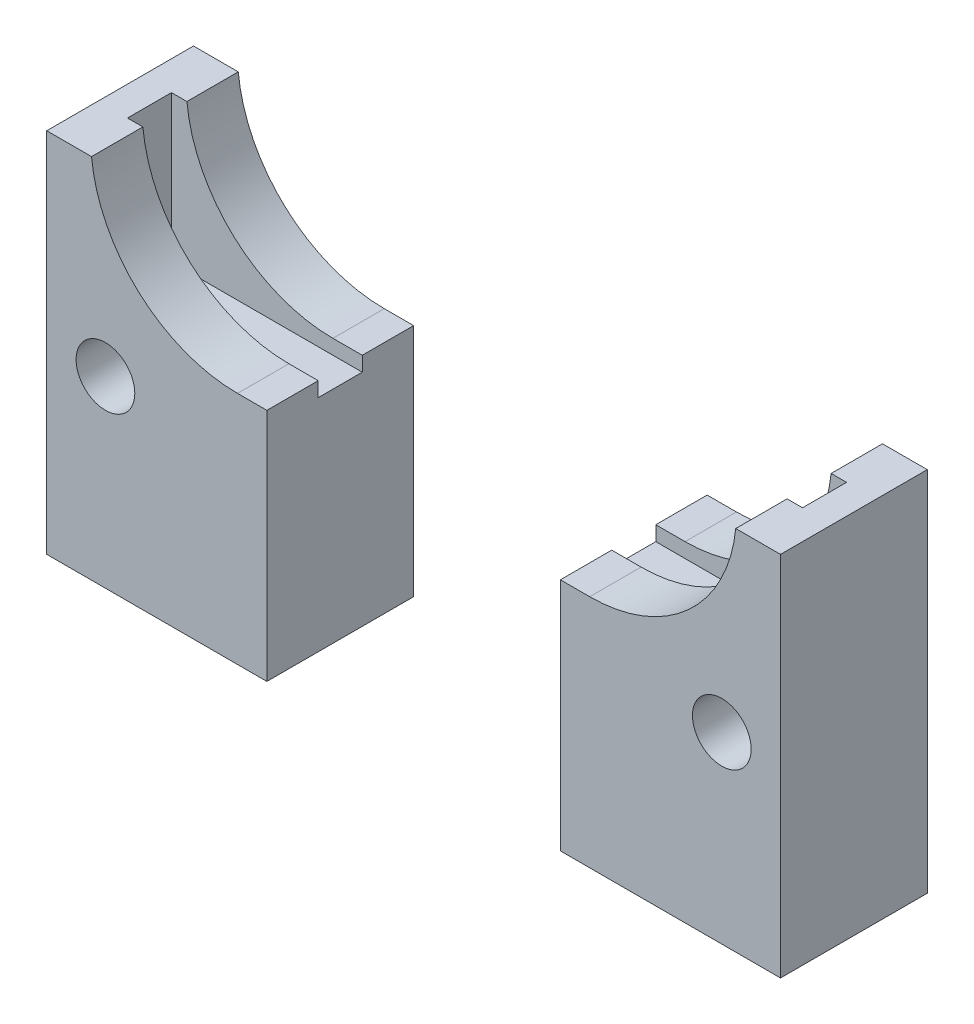
ISO-10303-21;
HEADER;
FILE_DESCRIPTION(('STEP AP214'),'2;1');
FILE_NAME('part.step','',(''),(''),'','','');
FILE_SCHEMA(('AUTOMOTIVE_DESIGN { 1 0 10303 214 1 1 1 1 }'));
ENDSEC;
DATA;
#1=APPLICATION_CONTEXT('core data for automotive mechanical design processes');
#2=APPLICATION_PROTOCOL_DEFINITION('international standard','automotive_design',2000,#1);
#3=PRODUCT_CONTEXT('',#1,'mechanical');
#4=PRODUCT('Part','Part','',(#3));
#5=PRODUCT_RELATED_PRODUCT_CATEGORY('part','',(#4));
#6=PRODUCT_DEFINITION_FORMATION('','',#4);
#7=PRODUCT_DEFINITION_CONTEXT('part definition',#1,'design');
#8=PRODUCT_DEFINITION('design','',#6,#7);
#9=PRODUCT_DEFINITION_SHAPE('','',#8);
#10=(LENGTH_UNIT() NAMED_UNIT(*) SI_UNIT(.MILLI.,.METRE.));
#11=(NAMED_UNIT(*) PLANE_ANGLE_UNIT() SI_UNIT($,.RADIAN.));
#12=(NAMED_UNIT(*) SI_UNIT($,.STERADIAN.) SOLID_ANGLE_UNIT());
#13=UNCERTAINTY_MEASURE_WITH_UNIT(LENGTH_MEASURE(1.E-05),#10,'distance_accuracy_value','');
#14=(GEOMETRIC_REPRESENTATION_CONTEXT(3) GLOBAL_UNCERTAINTY_ASSIGNED_CONTEXT((#13)) GLOBAL_UNIT_ASSIGNED_CONTEXT((#10,
#11,#12)) REPRESENTATION_CONTEXT('',''));
#15=CARTESIAN_POINT('',(0.,0.,0.));
#16=DIRECTION('',(0.,0.,1.));
#17=DIRECTION('',(1.,0.,0.));
#18=AXIS2_PLACEMENT_3D('',#15,#16,#17);
#19=CARTESIAN_POINT('',(25.,15.,5.));
#20=DIRECTION('',(-1.,0.,0.));
#21=DIRECTION('',(0.,0.,1.));
#22=AXIS2_PLACEMENT_3D('',#19,#20,#21);
#23=PLANE('',#22);
#24=DIRECTION('',(0.,-1.,0.));
#25=VECTOR('',#24,1.);
#26=CARTESIAN_POINT('',(25.,15.,5.));
#27=LINE('',#26,#25);
#28=CARTESIAN_POINT('',(25.,15.,5.));
#29=VERTEX_POINT('',#28);
#30=CARTESIAN_POINT('',(25.,-10.,5.));
#31=VERTEX_POINT('',#30);
#32=EDGE_CURVE('E153',#29,#31,#27,.T.);
#33=ORIENTED_EDGE('',*,*,#32,.T.);
#34=DIRECTION('',(0.,0.,1.));
#35=VECTOR('',#34,1.);
#36=CARTESIAN_POINT('',(25.,-10.,-5.));
#37=LINE('',#36,#35);
#38=CARTESIAN_POINT('',(25.,-10.,-5.));
#39=VERTEX_POINT('',#38);
#40=EDGE_CURVE('E236',#39,#31,#37,.T.);
#41=ORIENTED_EDGE('',*,*,#40,.F.);
#42=DIRECTION('',(0.,-1.,0.));
#43=VECTOR('',#42,1.);
#44=CARTESIAN_POINT('',(25.,15.,-5.));
#45=LINE('',#44,#43);
#46=CARTESIAN_POINT('',(25.,15.,-5.));
#47=VERTEX_POINT('',#46);
#48=EDGE_CURVE('E148',#47,#39,#45,.T.);
#49=ORIENTED_EDGE('',*,*,#48,.F.);
#50=DIRECTION('',(0.,0.,-1.));
#51=VECTOR('',#50,1.);
#52=CARTESIAN_POINT('',(25.,15.,5.));
#53=LINE('',#52,#51);
#54=EDGE_CURVE('E163',#29,#47,#53,.T.);
#55=ORIENTED_EDGE('',*,*,#54,.F.);
#56=EDGE_LOOP('',(#33,#41,#49,#55));
#57=FACE_BOUND('',#56,.T.);
#58=ADVANCED_FACE('F47',(#57),#23,.F.);
#59=CARTESIAN_POINT('',(-25.,15.,-5.));
#60=DIRECTION('',(0.,0.,1.));
#61=DIRECTION('',(1.,0.,0.));
#62=AXIS2_PLACEMENT_3D('',#59,#60,#61);
#63=PLANE('',#62);
#64=CARTESIAN_POINT('',(21.,2.5,-5.));
#65=DIRECTION('',(0.,0.,1.));
#66=DIRECTION('',(1.,0.,0.));
#67=AXIS2_PLACEMENT_3D('',#64,#65,#66);
#68=CIRCLE('',#67,2.);
#69=CARTESIAN_POINT('',(23.,2.5,-5.));
#70=VERTEX_POINT('',#69);
#71=EDGE_CURVE('E243',#70,#70,#68,.T.);
#72=ORIENTED_EDGE('',*,*,#71,.T.);
#73=EDGE_LOOP('',(#72));
#74=FACE_BOUND('',#73,.T.);
#75=DIRECTION('',(1.,0.,0.));
#76=VECTOR('',#75,1.);
#77=CARTESIAN_POINT('',(0.,6.,-5.));
#78=LINE('',#77,#76);
#79=CARTESIAN_POINT('',(10.,6.,-5.));
#80=VERTEX_POINT('',#79);
#81=CARTESIAN_POINT('',(12.,6.,-5.));
#82=VERTEX_POINT('',#81);
#83=EDGE_CURVE('E131',#80,#82,#78,.T.);
#84=ORIENTED_EDGE('',*,*,#83,.T.);
#85=CARTESIAN_POINT('',(12.,16.,-5.));
#86=DIRECTION('',(0.,0.,1.));
#87=DIRECTION('',(1.,0.,0.));
#88=AXIS2_PLACEMENT_3D('',#85,#86,#87);
#89=CIRCLE('',#88,10.);
#90=CARTESIAN_POINT('',(21.9498743710662,15.,-5.));
#91=VERTEX_POINT('',#90);
#92=EDGE_CURVE('E142',#82,#91,#89,.T.);
#93=ORIENTED_EDGE('',*,*,#92,.T.);
#94=DIRECTION('',(-1.,0.,0.));
#95=VECTOR('',#94,1.);
#96=CARTESIAN_POINT('',(-25.,15.,-5.));
#97=LINE('',#96,#95);
#98=EDGE_CURVE('E160',#47,#91,#97,.T.);
#99=ORIENTED_EDGE('',*,*,#98,.F.);
#100=ORIENTED_EDGE('',*,*,#48,.T.);
#101=DIRECTION('',(1.,0.,0.));
#102=VECTOR('',#101,1.);
#103=CARTESIAN_POINT('',(10.,-10.,-5.));
#104=LINE('',#103,#102);
#105=CARTESIAN_POINT('',(10.,-10.,-5.));
#106=VERTEX_POINT('',#105);
#107=EDGE_CURVE('E239',#106,#39,#104,.T.);
#108=ORIENTED_EDGE('',*,*,#107,.F.);
#109=DIRECTION('',(0.,1.,0.));
#110=VECTOR('',#109,1.);
#111=CARTESIAN_POINT('',(10.,0.,-5.));
#112=LINE('',#111,#110);
#113=EDGE_CURVE('E152',#106,#80,#112,.T.);
#114=ORIENTED_EDGE('',*,*,#113,.T.);
#115=EDGE_LOOP('',(#84,#93,#99,#100,#108,#114));
#116=FACE_BOUND('',#115,.T.);
#117=ADVANCED_FACE('F49',(#74,#116),#63,.F.);
#118=CARTESIAN_POINT('',(-25.,15.,5.));
#119=DIRECTION('',(0.,0.,-1.));
#120=DIRECTION('',(-1.,0.,0.));
#121=AXIS2_PLACEMENT_3D('',#118,#119,#120);
#122=PLANE('',#121);
#123=CARTESIAN_POINT('',(21.,2.5,5.));
#124=DIRECTION('',(0.,0.,1.));
#125=DIRECTION('',(1.,0.,0.));
#126=AXIS2_PLACEMENT_3D('',#123,#124,#125);
#127=CIRCLE('',#126,2.);
#128=CARTESIAN_POINT('',(23.,2.5,5.));
#129=VERTEX_POINT('',#128);
#130=EDGE_CURVE('E244',#129,#129,#127,.T.);
#131=ORIENTED_EDGE('',*,*,#130,.F.);
#132=EDGE_LOOP('',(#131));
#133=FACE_BOUND('',#132,.T.);
#134=DIRECTION('',(1.,0.,0.));
#135=VECTOR('',#134,1.);
#136=CARTESIAN_POINT('',(-25.,15.,5.));
#137=LINE('',#136,#135);
#138=CARTESIAN_POINT('',(21.9498743710662,15.,5.));
#139=VERTEX_POINT('',#138);
#140=EDGE_CURVE('E161',#139,#29,#137,.T.);
#141=ORIENTED_EDGE('',*,*,#140,.F.);
#142=CARTESIAN_POINT('',(12.,16.,5.));
#143=DIRECTION('',(0.,0.,1.));
#144=DIRECTION('',(1.,0.,0.));
#145=AXIS2_PLACEMENT_3D('',#142,#143,#144);
#146=CIRCLE('',#145,10.);
#147=CARTESIAN_POINT('',(12.,6.,5.));
#148=VERTEX_POINT('',#147);
#149=EDGE_CURVE('E138',#148,#139,#146,.T.);
#150=ORIENTED_EDGE('',*,*,#149,.F.);
#151=DIRECTION('',(1.,0.,0.));
#152=VECTOR('',#151,1.);
#153=CARTESIAN_POINT('',(0.,6.,5.));
#154=LINE('',#153,#152);
#155=CARTESIAN_POINT('',(10.,6.,5.));
#156=VERTEX_POINT('',#155);
#157=EDGE_CURVE('E192',#156,#148,#154,.T.);
#158=ORIENTED_EDGE('',*,*,#157,.F.);
#159=DIRECTION('',(0.,1.,0.));
#160=VECTOR('',#159,1.);
#161=CARTESIAN_POINT('',(10.,0.,5.));
#162=LINE('',#161,#160);
#163=CARTESIAN_POINT('',(10.,-10.,5.));
#164=VERTEX_POINT('',#163);
#165=EDGE_CURVE('E12',#164,#156,#162,.T.);
#166=ORIENTED_EDGE('',*,*,#165,.F.);
#167=DIRECTION('',(-1.,0.,0.));
#168=VECTOR('',#167,1.);
#169=CARTESIAN_POINT('',(10.,-10.,5.));
#170=LINE('',#169,#168);
#171=EDGE_CURVE('E156',#31,#164,#170,.T.);
#172=ORIENTED_EDGE('',*,*,#171,.F.);
#173=ORIENTED_EDGE('',*,*,#32,.F.);
#174=EDGE_LOOP('',(#141,#150,#158,#166,#172,#173));
#175=FACE_BOUND('',#174,.T.);
#176=ADVANCED_FACE('F211',(#133,#175),#122,.F.);
#177=CARTESIAN_POINT('',(0.,15.,0.));
#178=DIRECTION('',(0.,-1.,0.));
#179=DIRECTION('',(0.,0.,-1.));
#180=AXIS2_PLACEMENT_3D('',#177,#178,#179);
#181=PLANE('',#180);
#182=ORIENTED_EDGE('',*,*,#98,.T.);
#183=DIRECTION('',(0.,0.,1.));
#184=VECTOR('',#183,1.);
#185=CARTESIAN_POINT('',(21.9498743710662,15.,-5.));
#186=LINE('',#185,#184);
#187=CARTESIAN_POINT('',(21.9498743710662,15.,-1.5));
#188=VERTEX_POINT('',#187);
#189=EDGE_CURVE('E145',#91,#188,#186,.T.);
#190=ORIENTED_EDGE('',*,*,#189,.T.);
#191=DIRECTION('',(-1.,0.,0.));
#192=VECTOR('',#191,1.);
#193=CARTESIAN_POINT('',(-23.,15.,-1.5));
#194=LINE('',#193,#192);
#195=CARTESIAN_POINT('',(23.,15.,-1.5));
#196=VERTEX_POINT('',#195);
#197=EDGE_CURVE('E51',#196,#188,#194,.T.);
#198=ORIENTED_EDGE('',*,*,#197,.F.);
#199=DIRECTION('',(0.,0.,-1.));
#200=VECTOR('',#199,1.);
#201=CARTESIAN_POINT('',(23.,15.,-1.5));
#202=LINE('',#201,#200);
#203=CARTESIAN_POINT('',(23.,15.,1.5));
#204=VERTEX_POINT('',#203);
#205=EDGE_CURVE('E221',#204,#196,#202,.T.);
#206=ORIENTED_EDGE('',*,*,#205,.F.);
#207=DIRECTION('',(1.,0.,0.));
#208=VECTOR('',#207,1.);
#209=CARTESIAN_POINT('',(-23.,15.,1.5));
#210=LINE('',#209,#208);
#211=CARTESIAN_POINT('',(21.9498743710662,15.,1.5));
#212=VERTEX_POINT('',#211);
#213=EDGE_CURVE('E172',#212,#204,#210,.T.);
#214=ORIENTED_EDGE('',*,*,#213,.F.);
#215=EDGE_CURVE('E164',#212,#139,#186,.T.);
#216=ORIENTED_EDGE('',*,*,#215,.T.);
#217=ORIENTED_EDGE('',*,*,#140,.T.);
#218=ORIENTED_EDGE('',*,*,#54,.T.);
#219=EDGE_LOOP('',(#182,#190,#198,#206,#214,#216,#217,#218));
#220=FACE_BOUND('',#219,.T.);
#221=ADVANCED_FACE('F217',(#220),#181,.F.);
#222=CARTESIAN_POINT('',(23.,5.,-1.5));
#223=DIRECTION('',(1.,0.,0.));
#224=DIRECTION('',(0.,0.,-1.));
#225=AXIS2_PLACEMENT_3D('',#222,#223,#224);
#226=PLANE('',#225);
#227=ORIENTED_EDGE('',*,*,#205,.T.);
#228=DIRECTION('',(0.,1.,0.));
#229=VECTOR('',#228,1.);
#230=CARTESIAN_POINT('',(23.,5.,-1.5));
#231=LINE('',#230,#229);
#232=CARTESIAN_POINT('',(23.,5.,-1.5));
#233=VERTEX_POINT('',#232);
#234=EDGE_CURVE('E169',#233,#196,#231,.T.);
#235=ORIENTED_EDGE('',*,*,#234,.F.);
#236=DIRECTION('',(0.,0.,-1.));
#237=VECTOR('',#236,1.);
#238=CARTESIAN_POINT('',(23.,5.,-1.5));
#239=LINE('',#238,#237);
#240=CARTESIAN_POINT('',(23.,5.,1.5));
#241=VERTEX_POINT('',#240);
#242=EDGE_CURVE('E168',#241,#233,#239,.T.);
#243=ORIENTED_EDGE('',*,*,#242,.F.);
#244=DIRECTION('',(0.,1.,0.));
#245=VECTOR('',#244,1.);
#246=CARTESIAN_POINT('',(23.,5.,1.5));
#247=LINE('',#246,#245);
#248=EDGE_CURVE('E183',#241,#204,#247,.T.);
#249=ORIENTED_EDGE('',*,*,#248,.T.);
#250=EDGE_LOOP('',(#227,#235,#243,#249));
#251=FACE_BOUND('',#250,.T.);
#252=ADVANCED_FACE('F263',(#251),#226,.F.);
#253=CARTESIAN_POINT('',(-23.,5.,1.5));
#254=DIRECTION('',(0.,0.,1.));
#255=DIRECTION('',(1.,0.,0.));
#256=AXIS2_PLACEMENT_3D('',#253,#254,#255);
#257=PLANE('',#256);
#258=DIRECTION('',(1.,0.,0.));
#259=VECTOR('',#258,1.);
#260=CARTESIAN_POINT('',(-23.,6.,1.5));
#261=LINE('',#260,#259);
#262=CARTESIAN_POINT('',(10.,6.,1.5));
#263=VERTEX_POINT('',#262);
#264=CARTESIAN_POINT('',(12.,6.,1.5));
#265=VERTEX_POINT('',#264);
#266=EDGE_CURVE('E180',#263,#265,#261,.T.);
#267=ORIENTED_EDGE('',*,*,#266,.T.);
#268=CARTESIAN_POINT('',(12.,16.,1.5));
#269=DIRECTION('',(0.,0.,1.));
#270=DIRECTION('',(1.,0.,0.));
#271=AXIS2_PLACEMENT_3D('',#268,#269,#270);
#272=CIRCLE('',#271,10.);
#273=EDGE_CURVE('E173',#265,#212,#272,.T.);
#274=ORIENTED_EDGE('',*,*,#273,.T.);
#275=ORIENTED_EDGE('',*,*,#213,.T.);
#276=ORIENTED_EDGE('',*,*,#248,.F.);
#277=DIRECTION('',(1.,0.,0.));
#278=VECTOR('',#277,1.);
#279=CARTESIAN_POINT('',(-23.,5.,1.5));
#280=LINE('',#279,#278);
#281=CARTESIAN_POINT('',(10.,5.,1.5));
#282=VERTEX_POINT('',#281);
#283=EDGE_CURVE('E166',#282,#241,#280,.T.);
#284=ORIENTED_EDGE('',*,*,#283,.F.);
#285=DIRECTION('',(0.,1.,0.));
#286=VECTOR('',#285,1.);
#287=CARTESIAN_POINT('',(10.,5.,1.5));
#288=LINE('',#287,#286);
#289=EDGE_CURVE('E65',#282,#263,#288,.T.);
#290=ORIENTED_EDGE('',*,*,#289,.T.);
#291=EDGE_LOOP('',(#267,#274,#275,#276,#284,#290));
#292=FACE_BOUND('',#291,.T.);
#293=ADVANCED_FACE('F274',(#292),#257,.F.);
#294=CARTESIAN_POINT('',(-23.,5.,-1.5));
#295=DIRECTION('',(0.,0.,-1.));
#296=DIRECTION('',(-1.,0.,0.));
#297=AXIS2_PLACEMENT_3D('',#294,#295,#296);
#298=PLANE('',#297);
#299=ORIENTED_EDGE('',*,*,#197,.T.);
#300=CARTESIAN_POINT('',(12.,16.,-1.5));
#301=DIRECTION('',(0.,0.,-1.));
#302=DIRECTION('',(-1.,0.,0.));
#303=AXIS2_PLACEMENT_3D('',#300,#301,#302);
#304=CIRCLE('',#303,10.);
#305=CARTESIAN_POINT('',(12.,6.,-1.5));
#306=VERTEX_POINT('',#305);
#307=EDGE_CURVE('E233',#188,#306,#304,.T.);
#308=ORIENTED_EDGE('',*,*,#307,.T.);
#309=DIRECTION('',(-1.,0.,0.));
#310=VECTOR('',#309,1.);
#311=CARTESIAN_POINT('',(-23.,6.,-1.5));
#312=LINE('',#311,#310);
#313=CARTESIAN_POINT('',(10.,6.,-1.5));
#314=VERTEX_POINT('',#313);
#315=EDGE_CURVE('E134',#306,#314,#312,.T.);
#316=ORIENTED_EDGE('',*,*,#315,.T.);
#317=DIRECTION('',(0.,-1.,0.));
#318=VECTOR('',#317,1.);
#319=CARTESIAN_POINT('',(10.,5.,-1.5));
#320=LINE('',#319,#318);
#321=CARTESIAN_POINT('',(10.,5.,-1.5));
#322=VERTEX_POINT('',#321);
#323=EDGE_CURVE('E188',#314,#322,#320,.T.);
#324=ORIENTED_EDGE('',*,*,#323,.T.);
#325=DIRECTION('',(-1.,0.,0.));
#326=VECTOR('',#325,1.);
#327=CARTESIAN_POINT('',(-23.,5.,-1.5));
#328=LINE('',#327,#326);
#329=EDGE_CURVE('E170',#233,#322,#328,.T.);
#330=ORIENTED_EDGE('',*,*,#329,.F.);
#331=ORIENTED_EDGE('',*,*,#234,.T.);
#332=EDGE_LOOP('',(#299,#308,#316,#324,#330,#331));
#333=FACE_BOUND('',#332,.T.);
#334=ADVANCED_FACE('F284',(#333),#298,.F.);
#335=CARTESIAN_POINT('',(0.,5.,0.));
#336=DIRECTION('',(0.,1.,0.));
#337=DIRECTION('',(0.,0.,1.));
#338=AXIS2_PLACEMENT_3D('',#335,#336,#337);
#339=PLANE('',#338);
#340=DIRECTION('',(0.,0.,-1.));
#341=VECTOR('',#340,1.);
#342=CARTESIAN_POINT('',(10.,5.,0.));
#343=LINE('',#342,#341);
#344=EDGE_CURVE('E57',#282,#322,#343,.T.);
#345=ORIENTED_EDGE('',*,*,#344,.F.);
#346=ORIENTED_EDGE('',*,*,#283,.T.);
#347=ORIENTED_EDGE('',*,*,#242,.T.);
#348=ORIENTED_EDGE('',*,*,#329,.T.);
#349=EDGE_LOOP('',(#345,#346,#347,#348));
#350=FACE_BOUND('',#349,.T.);
#351=ADVANCED_FACE('F281',(#350),#339,.T.);
#352=CARTESIAN_POINT('',(12.,16.,-5.));
#353=DIRECTION('',(0.,0.,1.));
#354=DIRECTION('',(1.,0.,0.));
#355=AXIS2_PLACEMENT_3D('',#352,#353,#354);
#356=CYLINDRICAL_SURFACE('',#355,10.);
#357=DIRECTION('',(0.,0.,1.));
#358=VECTOR('',#357,1.);
#359=CARTESIAN_POINT('',(12.,6.,-5.));
#360=LINE('',#359,#358);
#361=EDGE_CURVE('E140',#265,#148,#360,.T.);
#362=ORIENTED_EDGE('',*,*,#361,.T.);
#363=ORIENTED_EDGE('',*,*,#149,.T.);
#364=ORIENTED_EDGE('',*,*,#215,.F.);
#365=ORIENTED_EDGE('',*,*,#273,.F.);
#366=EDGE_LOOP('',(#362,#363,#364,#365));
#367=FACE_BOUND('',#366,.T.);
#368=ADVANCED_FACE('F215',(#367),#356,.F.);
#369=ORIENTED_EDGE('',*,*,#189,.F.);
#370=ORIENTED_EDGE('',*,*,#92,.F.);
#371=EDGE_CURVE('E126',#82,#306,#360,.T.);
#372=ORIENTED_EDGE('',*,*,#371,.T.);
#373=ORIENTED_EDGE('',*,*,#307,.F.);
#374=EDGE_LOOP('',(#369,#370,#372,#373));
#375=FACE_BOUND('',#374,.T.);
#376=ADVANCED_FACE('F143',(#375),#356,.F.);
#377=CARTESIAN_POINT('',(0.,6.,-5.));
#378=DIRECTION('',(0.,-1.,0.));
#379=DIRECTION('',(0.,0.,-1.));
#380=AXIS2_PLACEMENT_3D('',#377,#378,#379);
#381=PLANE('',#380);
#382=DIRECTION('',(0.,0.,1.));
#383=VECTOR('',#382,1.);
#384=CARTESIAN_POINT('',(10.,6.,-5.));
#385=LINE('',#384,#383);
#386=EDGE_CURVE('E137',#263,#156,#385,.T.);
#387=ORIENTED_EDGE('',*,*,#386,.T.);
#388=ORIENTED_EDGE('',*,*,#157,.T.);
#389=ORIENTED_EDGE('',*,*,#361,.F.);
#390=ORIENTED_EDGE('',*,*,#266,.F.);
#391=EDGE_LOOP('',(#387,#388,#389,#390));
#392=FACE_BOUND('',#391,.T.);
#393=ADVANCED_FACE('F201',(#392),#381,.F.);
#394=ORIENTED_EDGE('',*,*,#371,.F.);
#395=ORIENTED_EDGE('',*,*,#83,.F.);
#396=EDGE_CURVE('E191',#80,#314,#385,.T.);
#397=ORIENTED_EDGE('',*,*,#396,.T.);
#398=ORIENTED_EDGE('',*,*,#315,.F.);
#399=EDGE_LOOP('',(#394,#395,#397,#398));
#400=FACE_BOUND('',#399,.T.);
#401=ADVANCED_FACE('F128',(#400),#381,.F.);
#402=CARTESIAN_POINT('',(10.,0.,-5.));
#403=DIRECTION('',(1.,0.,0.));
#404=DIRECTION('',(0.,0.,-1.));
#405=AXIS2_PLACEMENT_3D('',#402,#403,#404);
#406=PLANE('',#405);
#407=ORIENTED_EDGE('',*,*,#344,.T.);
#408=ORIENTED_EDGE('',*,*,#323,.F.);
#409=ORIENTED_EDGE('',*,*,#396,.F.);
#410=ORIENTED_EDGE('',*,*,#113,.F.);
#411=DIRECTION('',(0.,0.,-1.));
#412=VECTOR('',#411,1.);
#413=CARTESIAN_POINT('',(10.,-10.,-5.));
#414=LINE('',#413,#412);
#415=EDGE_CURVE('E206',#164,#106,#414,.T.);
#416=ORIENTED_EDGE('',*,*,#415,.F.);
#417=ORIENTED_EDGE('',*,*,#165,.T.);
#418=ORIENTED_EDGE('',*,*,#386,.F.);
#419=ORIENTED_EDGE('',*,*,#289,.F.);
#420=EDGE_LOOP('',(#407,#408,#409,#410,#416,#417,#418,#419));
#421=FACE_BOUND('',#420,.T.);
#422=ADVANCED_FACE('F204',(#421),#406,.F.);
#423=CARTESIAN_POINT('',(0.,-10.,0.));
#424=DIRECTION('',(0.,1.,0.));
#425=DIRECTION('',(0.,0.,1.));
#426=AXIS2_PLACEMENT_3D('',#423,#424,#425);
#427=PLANE('',#426);
#428=ORIENTED_EDGE('',*,*,#415,.T.);
#429=ORIENTED_EDGE('',*,*,#107,.T.);
#430=ORIENTED_EDGE('',*,*,#40,.T.);
#431=ORIENTED_EDGE('',*,*,#171,.T.);
#432=EDGE_LOOP('',(#428,#429,#430,#431));
#433=FACE_BOUND('',#432,.T.);
#434=ADVANCED_FACE('F254',(#433),#427,.F.);
#435=CARTESIAN_POINT('',(21.,2.5,-5.));
#436=DIRECTION('',(0.,0.,1.));
#437=DIRECTION('',(1.,0.,0.));
#438=AXIS2_PLACEMENT_3D('',#435,#436,#437);
#439=CYLINDRICAL_SURFACE('',#438,2.);
#440=ORIENTED_EDGE('',*,*,#71,.F.);
#441=EDGE_LOOP('',(#440));
#442=FACE_BOUND('',#441,.T.);
#443=ORIENTED_EDGE('',*,*,#130,.T.);
#444=EDGE_LOOP('',(#443));
#445=FACE_BOUND('',#444,.T.);
#446=ADVANCED_FACE('F251',(#442,#445),#439,.F.);
#447=CLOSED_SHELL('',(#58,#117,#176,#221,#252,#293,#334,#351,#368,#376,#393,#401,#422,#434,#446));
#448=MANIFOLD_SOLID_BREP('B2',#447);
#449=CARTESIAN_POINT('',(-25.,15.,5.));
#450=DIRECTION('',(1.,0.,0.));
#451=DIRECTION('',(0.,0.,-1.));
#452=AXIS2_PLACEMENT_3D('',#449,#450,#451);
#453=PLANE('',#452);
#454=DIRECTION('',(0.,-1.,0.));
#455=VECTOR('',#454,1.);
#456=CARTESIAN_POINT('',(-25.,15.,-5.));
#457=LINE('',#456,#455);
#458=CARTESIAN_POINT('',(-25.,15.,-5.));
#459=VERTEX_POINT('',#458);
#460=CARTESIAN_POINT('',(-25.,-10.,-5.));
#461=VERTEX_POINT('',#460);
#462=EDGE_CURVE('E506',#459,#461,#457,.T.);
#463=ORIENTED_EDGE('',*,*,#462,.T.);
#464=DIRECTION('',(0.,0.,-1.));
#465=VECTOR('',#464,1.);
#466=CARTESIAN_POINT('',(-25.,-10.,-5.));
#467=LINE('',#466,#465);
#468=CARTESIAN_POINT('',(-25.,-10.,5.));
#469=VERTEX_POINT('',#468);
#470=EDGE_CURVE('E509',#469,#461,#467,.T.);
#471=ORIENTED_EDGE('',*,*,#470,.F.);
#472=DIRECTION('',(0.,-1.,0.));
#473=VECTOR('',#472,1.);
#474=CARTESIAN_POINT('',(-25.,15.,5.));
#475=LINE('',#474,#473);
#476=CARTESIAN_POINT('',(-25.,15.,5.));
#477=VERTEX_POINT('',#476);
#478=EDGE_CURVE('E513',#477,#469,#475,.T.);
#479=ORIENTED_EDGE('',*,*,#478,.F.);
#480=DIRECTION('',(0.,0.,1.));
#481=VECTOR('',#480,1.);
#482=CARTESIAN_POINT('',(-25.,15.,5.));
#483=LINE('',#482,#481);
#484=EDGE_CURVE('E439',#459,#477,#483,.T.);
#485=ORIENTED_EDGE('',*,*,#484,.F.);
#486=EDGE_LOOP('',(#463,#471,#479,#485));
#487=FACE_BOUND('',#486,.T.);
#488=ADVANCED_FACE('F416',(#487),#453,.F.);
#489=CARTESIAN_POINT('',(-23.,5.,-1.5));
#490=DIRECTION('',(-1.,0.,0.));
#491=DIRECTION('',(0.,0.,1.));
#492=AXIS2_PLACEMENT_3D('',#489,#490,#491);
#493=PLANE('',#492);
#494=DIRECTION('',(0.,0.,1.));
#495=VECTOR('',#494,1.);
#496=CARTESIAN_POINT('',(-23.,15.,-1.5));
#497=LINE('',#496,#495);
#498=CARTESIAN_POINT('',(-23.,15.,-1.5));
#499=VERTEX_POINT('',#498);
#500=CARTESIAN_POINT('',(-23.,15.,1.5));
#501=VERTEX_POINT('',#500);
#502=EDGE_CURVE('E581',#499,#501,#497,.T.);
#503=ORIENTED_EDGE('',*,*,#502,.T.);
#504=DIRECTION('',(0.,1.,0.));
#505=VECTOR('',#504,1.);
#506=CARTESIAN_POINT('',(-23.,5.,1.5));
#507=LINE('',#506,#505);
#508=CARTESIAN_POINT('',(-23.,5.,1.5));
#509=VERTEX_POINT('',#508);
#510=EDGE_CURVE('E586',#509,#501,#507,.T.);
#511=ORIENTED_EDGE('',*,*,#510,.F.);
#512=DIRECTION('',(0.,0.,1.));
#513=VECTOR('',#512,1.);
#514=CARTESIAN_POINT('',(-23.,5.,-1.5));
#515=LINE('',#514,#513);
#516=CARTESIAN_POINT('',(-23.,5.,-1.5));
#517=VERTEX_POINT('',#516);
#518=EDGE_CURVE('E572',#517,#509,#515,.T.);
#519=ORIENTED_EDGE('',*,*,#518,.F.);
#520=DIRECTION('',(0.,1.,0.));
#521=VECTOR('',#520,1.);
#522=CARTESIAN_POINT('',(-23.,5.,-1.5));
#523=LINE('',#522,#521);
#524=EDGE_CURVE('E579',#517,#499,#523,.T.);
#525=ORIENTED_EDGE('',*,*,#524,.T.);
#526=EDGE_LOOP('',(#503,#511,#519,#525));
#527=FACE_BOUND('',#526,.T.);
#528=ADVANCED_FACE('F633',(#527),#493,.F.);
#529=CARTESIAN_POINT('',(0.,5.,0.));
#530=DIRECTION('',(0.,1.,0.));
#531=DIRECTION('',(0.,0.,1.));
#532=AXIS2_PLACEMENT_3D('',#529,#530,#531);
#533=PLANE('',#532);
#534=DIRECTION('',(1.,0.,0.));
#535=VECTOR('',#534,1.);
#536=CARTESIAN_POINT('',(-23.,5.,1.5));
#537=LINE('',#536,#535);
#538=CARTESIAN_POINT('',(-10.,5.,1.5));
#539=VERTEX_POINT('',#538);
#540=EDGE_CURVE('E576',#509,#539,#537,.T.);
#541=ORIENTED_EDGE('',*,*,#540,.T.);
#542=DIRECTION('',(0.,0.,-1.));
#543=VECTOR('',#542,1.);
#544=CARTESIAN_POINT('',(-10.,5.,0.));
#545=LINE('',#544,#543);
#546=CARTESIAN_POINT('',(-10.,5.,-1.5));
#547=VERTEX_POINT('',#546);
#548=EDGE_CURVE('E512',#539,#547,#545,.T.);
#549=ORIENTED_EDGE('',*,*,#548,.T.);
#550=DIRECTION('',(-1.,0.,0.));
#551=VECTOR('',#550,1.);
#552=CARTESIAN_POINT('',(-23.,5.,-1.5));
#553=LINE('',#552,#551);
#554=EDGE_CURVE('E570',#547,#517,#553,.T.);
#555=ORIENTED_EDGE('',*,*,#554,.T.);
#556=ORIENTED_EDGE('',*,*,#518,.T.);
#557=EDGE_LOOP('',(#541,#549,#555,#556));
#558=FACE_BOUND('',#557,.T.);
#559=ADVANCED_FACE('F609',(#558),#533,.T.);
#560=CARTESIAN_POINT('',(-23.,5.,-1.5));
#561=DIRECTION('',(0.,0.,-1.));
#562=DIRECTION('',(-1.,0.,0.));
#563=AXIS2_PLACEMENT_3D('',#560,#561,#562);
#564=PLANE('',#563);
#565=CARTESIAN_POINT('',(-12.,16.,-1.5));
#566=DIRECTION('',(0.,0.,-1.));
#567=DIRECTION('',(-1.,0.,0.));
#568=AXIS2_PLACEMENT_3D('',#565,#566,#567);
#569=CIRCLE('',#568,10.);
#570=CARTESIAN_POINT('',(-21.9498743710662,15.,-1.5));
#571=VERTEX_POINT('',#570);
#572=CARTESIAN_POINT('',(-12.,6.,-1.5));
#573=VERTEX_POINT('',#572);
#574=EDGE_CURVE('E45',#571,#573,#569,.F.);
#575=ORIENTED_EDGE('',*,*,#574,.F.);
#576=DIRECTION('',(-1.,0.,0.));
#577=VECTOR('',#576,1.);
#578=CARTESIAN_POINT('',(-23.,15.,-1.5));
#579=LINE('',#578,#577);
#580=EDGE_CURVE('E569',#571,#499,#579,.T.);
#581=ORIENTED_EDGE('',*,*,#580,.T.);
#582=ORIENTED_EDGE('',*,*,#524,.F.);
#583=ORIENTED_EDGE('',*,*,#554,.F.);
#584=DIRECTION('',(0.,-1.,0.));
#585=VECTOR('',#584,1.);
#586=CARTESIAN_POINT('',(-10.,5.,-1.5));
#587=LINE('',#586,#585);
#588=CARTESIAN_POINT('',(-10.,6.,-1.5));
#589=VERTEX_POINT('',#588);
#590=EDGE_CURVE('E431',#589,#547,#587,.T.);
#591=ORIENTED_EDGE('',*,*,#590,.F.);
#592=DIRECTION('',(1.,0.,0.));
#593=VECTOR('',#592,1.);
#594=CARTESIAN_POINT('',(-23.,6.,-1.5));
#595=LINE('',#594,#593);
#596=EDGE_CURVE('E424',#573,#589,#595,.T.);
#597=ORIENTED_EDGE('',*,*,#596,.F.);
#598=EDGE_LOOP('',(#575,#581,#582,#583,#591,#597));
#599=FACE_BOUND('',#598,.T.);
#600=ADVANCED_FACE('F605',(#599),#564,.F.);
#601=CARTESIAN_POINT('',(-23.,5.,1.5));
#602=DIRECTION('',(0.,0.,1.));
#603=DIRECTION('',(1.,0.,0.));
#604=AXIS2_PLACEMENT_3D('',#601,#602,#603);
#605=PLANE('',#604);
#606=CARTESIAN_POINT('',(-12.,16.,1.5));
#607=DIRECTION('',(0.,0.,1.));
#608=DIRECTION('',(1.,0.,0.));
#609=AXIS2_PLACEMENT_3D('',#606,#607,#608);
#610=CIRCLE('',#609,10.);
#611=CARTESIAN_POINT('',(-12.,6.,1.5));
#612=VERTEX_POINT('',#611);
#613=CARTESIAN_POINT('',(-21.9498743710662,15.,1.5));
#614=VERTEX_POINT('',#613);
#615=EDGE_CURVE('E567',#612,#614,#610,.F.);
#616=ORIENTED_EDGE('',*,*,#615,.F.);
#617=DIRECTION('',(-1.,0.,0.));
#618=VECTOR('',#617,1.);
#619=CARTESIAN_POINT('',(-23.,6.,1.5));
#620=LINE('',#619,#618);
#621=CARTESIAN_POINT('',(-10.,6.,1.5));
#622=VERTEX_POINT('',#621);
#623=EDGE_CURVE('E565',#622,#612,#620,.T.);
#624=ORIENTED_EDGE('',*,*,#623,.F.);
#625=DIRECTION('',(0.,1.,0.));
#626=VECTOR('',#625,1.);
#627=CARTESIAN_POINT('',(-10.,5.,1.5));
#628=LINE('',#627,#626);
#629=EDGE_CURVE('E563',#539,#622,#628,.T.);
#630=ORIENTED_EDGE('',*,*,#629,.F.);
#631=ORIENTED_EDGE('',*,*,#540,.F.);
#632=ORIENTED_EDGE('',*,*,#510,.T.);
#633=DIRECTION('',(1.,0.,0.));
#634=VECTOR('',#633,1.);
#635=CARTESIAN_POINT('',(-23.,15.,1.5));
#636=LINE('',#635,#634);
#637=EDGE_CURVE('E573',#501,#614,#636,.T.);
#638=ORIENTED_EDGE('',*,*,#637,.T.);
#639=EDGE_LOOP('',(#616,#624,#630,#631,#632,#638));
#640=FACE_BOUND('',#639,.T.);
#641=ADVANCED_FACE('F616',(#640),#605,.F.);
#642=CARTESIAN_POINT('',(0.,15.,0.));
#643=DIRECTION('',(0.,-1.,0.));
#644=DIRECTION('',(0.,0.,-1.));
#645=AXIS2_PLACEMENT_3D('',#642,#643,#644);
#646=PLANE('',#645);
#647=DIRECTION('',(0.,0.,1.));
#648=VECTOR('',#647,1.);
#649=CARTESIAN_POINT('',(-21.9498743710662,15.,-5.));
#650=LINE('',#649,#648);
#651=CARTESIAN_POINT('',(-21.9498743710662,15.,-5.));
#652=VERTEX_POINT('',#651);
#653=EDGE_CURVE('E553',#652,#571,#650,.T.);
#654=ORIENTED_EDGE('',*,*,#653,.F.);
#655=DIRECTION('',(-1.,0.,0.));
#656=VECTOR('',#655,1.);
#657=CARTESIAN_POINT('',(-25.,15.,-5.));
#658=LINE('',#657,#656);
#659=EDGE_CURVE('E588',#652,#459,#658,.T.);
#660=ORIENTED_EDGE('',*,*,#659,.T.);
#661=ORIENTED_EDGE('',*,*,#484,.T.);
#662=DIRECTION('',(1.,0.,0.));
#663=VECTOR('',#662,1.);
#664=CARTESIAN_POINT('',(-25.,15.,5.));
#665=LINE('',#664,#663);
#666=CARTESIAN_POINT('',(-21.9498743710662,15.,5.));
#667=VERTEX_POINT('',#666);
#668=EDGE_CURVE('E593',#477,#667,#665,.T.);
#669=ORIENTED_EDGE('',*,*,#668,.T.);
#670=EDGE_CURVE('E555',#614,#667,#650,.T.);
#671=ORIENTED_EDGE('',*,*,#670,.F.);
#672=ORIENTED_EDGE('',*,*,#637,.F.);
#673=ORIENTED_EDGE('',*,*,#502,.F.);
#674=ORIENTED_EDGE('',*,*,#580,.F.);
#675=EDGE_LOOP('',(#654,#660,#661,#669,#671,#672,#673,#674));
#676=FACE_BOUND('',#675,.T.);
#677=ADVANCED_FACE('F629',(#676),#646,.F.);
#678=CARTESIAN_POINT('',(-25.,15.,5.));
#679=DIRECTION('',(0.,0.,-1.));
#680=DIRECTION('',(-1.,0.,0.));
#681=AXIS2_PLACEMENT_3D('',#678,#679,#680);
#682=PLANE('',#681);
#683=CARTESIAN_POINT('',(-21.,2.5,5.));
#684=DIRECTION('',(0.,0.,1.));
#685=DIRECTION('',(1.,0.,0.));
#686=AXIS2_PLACEMENT_3D('',#683,#684,#685);
#687=CIRCLE('',#686,2.);
#688=CARTESIAN_POINT('',(-19.,2.5,5.));
#689=VERTEX_POINT('',#688);
#690=EDGE_CURVE('E532',#689,#689,#687,.T.);
#691=ORIENTED_EDGE('',*,*,#690,.F.);
#692=EDGE_LOOP('',(#691));
#693=FACE_BOUND('',#692,.T.);
#694=CARTESIAN_POINT('',(-12.,16.,5.));
#695=DIRECTION('',(0.,0.,1.));
#696=DIRECTION('',(1.,0.,0.));
#697=AXIS2_PLACEMENT_3D('',#694,#695,#696);
#698=CIRCLE('',#697,10.);
#699=CARTESIAN_POINT('',(-12.,6.,5.));
#700=VERTEX_POINT('',#699);
#701=EDGE_CURVE('E538',#700,#667,#698,.F.);
#702=ORIENTED_EDGE('',*,*,#701,.T.);
#703=ORIENTED_EDGE('',*,*,#668,.F.);
#704=ORIENTED_EDGE('',*,*,#478,.T.);
#705=DIRECTION('',(-1.,0.,0.));
#706=VECTOR('',#705,1.);
#707=CARTESIAN_POINT('',(-25.,-10.,5.));
#708=LINE('',#707,#706);
#709=CARTESIAN_POINT('',(-10.,-10.,5.));
#710=VERTEX_POINT('',#709);
#711=EDGE_CURVE('E528',#710,#469,#708,.T.);
#712=ORIENTED_EDGE('',*,*,#711,.F.);
#713=DIRECTION('',(0.,1.,0.));
#714=VECTOR('',#713,1.);
#715=CARTESIAN_POINT('',(-10.,0.,5.));
#716=LINE('',#715,#714);
#717=CARTESIAN_POINT('',(-10.,6.,5.));
#718=VERTEX_POINT('',#717);
#719=EDGE_CURVE('E542',#710,#718,#716,.T.);
#720=ORIENTED_EDGE('',*,*,#719,.T.);
#721=DIRECTION('',(-1.,0.,0.));
#722=VECTOR('',#721,1.);
#723=CARTESIAN_POINT('',(0.,6.,5.));
#724=LINE('',#723,#722);
#725=EDGE_CURVE('E548',#718,#700,#724,.T.);
#726=ORIENTED_EDGE('',*,*,#725,.T.);
#727=EDGE_LOOP('',(#702,#703,#704,#712,#720,#726));
#728=FACE_BOUND('',#727,.T.);
#729=ADVANCED_FACE('F627',(#693,#728),#682,.F.);
#730=CARTESIAN_POINT('',(-25.,15.,-5.));
#731=DIRECTION('',(0.,0.,1.));
#732=DIRECTION('',(1.,0.,0.));
#733=AXIS2_PLACEMENT_3D('',#730,#731,#732);
#734=PLANE('',#733);
#735=CARTESIAN_POINT('',(-21.,2.5,-5.));
#736=DIRECTION('',(0.,0.,1.));
#737=DIRECTION('',(1.,0.,0.));
#738=AXIS2_PLACEMENT_3D('',#735,#736,#737);
#739=CIRCLE('',#738,2.);
#740=CARTESIAN_POINT('',(-19.,2.5,-5.));
#741=VERTEX_POINT('',#740);
#742=EDGE_CURVE('E529',#741,#741,#739,.T.);
#743=ORIENTED_EDGE('',*,*,#742,.T.);
#744=EDGE_LOOP('',(#743));
#745=FACE_BOUND('',#744,.T.);
#746=CARTESIAN_POINT('',(-12.,16.,-5.));
#747=DIRECTION('',(0.,0.,1.));
#748=DIRECTION('',(1.,0.,0.));
#749=AXIS2_PLACEMENT_3D('',#746,#747,#748);
#750=CIRCLE('',#749,10.);
#751=CARTESIAN_POINT('',(-12.,6.,-5.));
#752=VERTEX_POINT('',#751);
#753=EDGE_CURVE('E539',#752,#652,#750,.F.);
#754=ORIENTED_EDGE('',*,*,#753,.F.);
#755=DIRECTION('',(-1.,0.,0.));
#756=VECTOR('',#755,1.);
#757=CARTESIAN_POINT('',(0.,6.,-5.));
#758=LINE('',#757,#756);
#759=CARTESIAN_POINT('',(-10.,6.,-5.));
#760=VERTEX_POINT('',#759);
#761=EDGE_CURVE('E541',#760,#752,#758,.T.);
#762=ORIENTED_EDGE('',*,*,#761,.F.);
#763=DIRECTION('',(0.,1.,0.));
#764=VECTOR('',#763,1.);
#765=CARTESIAN_POINT('',(-10.,0.,-5.));
#766=LINE('',#765,#764);
#767=CARTESIAN_POINT('',(-10.,-10.,-5.));
#768=VERTEX_POINT('',#767);
#769=EDGE_CURVE('E519',#768,#760,#766,.T.);
#770=ORIENTED_EDGE('',*,*,#769,.F.);
#771=DIRECTION('',(1.,0.,0.));
#772=VECTOR('',#771,1.);
#773=CARTESIAN_POINT('',(-25.,-10.,-5.));
#774=LINE('',#773,#772);
#775=EDGE_CURVE('E516',#461,#768,#774,.T.);
#776=ORIENTED_EDGE('',*,*,#775,.F.);
#777=ORIENTED_EDGE('',*,*,#462,.F.);
#778=ORIENTED_EDGE('',*,*,#659,.F.);
#779=EDGE_LOOP('',(#754,#762,#770,#776,#777,#778));
#780=FACE_BOUND('',#779,.T.);
#781=ADVANCED_FACE('F418',(#745,#780),#734,.F.);
#782=CARTESIAN_POINT('',(-10.,0.,-5.));
#783=DIRECTION('',(1.,0.,0.));
#784=DIRECTION('',(0.,0.,-1.));
#785=AXIS2_PLACEMENT_3D('',#782,#783,#784);
#786=PLANE('',#785);
#787=ORIENTED_EDGE('',*,*,#629,.T.);
#788=DIRECTION('',(0.,0.,1.));
#789=VECTOR('',#788,1.);
#790=CARTESIAN_POINT('',(-10.,6.,-5.));
#791=LINE('',#790,#789);
#792=EDGE_CURVE('E558',#622,#718,#791,.T.);
#793=ORIENTED_EDGE('',*,*,#792,.T.);
#794=ORIENTED_EDGE('',*,*,#719,.F.);
#795=DIRECTION('',(0.,0.,1.));
#796=VECTOR('',#795,1.);
#797=CARTESIAN_POINT('',(-10.,-10.,-5.));
#798=LINE('',#797,#796);
#799=EDGE_CURVE('E523',#768,#710,#798,.T.);
#800=ORIENTED_EDGE('',*,*,#799,.F.);
#801=ORIENTED_EDGE('',*,*,#769,.T.);
#802=EDGE_CURVE('E556',#760,#589,#791,.T.);
#803=ORIENTED_EDGE('',*,*,#802,.T.);
#804=ORIENTED_EDGE('',*,*,#590,.T.);
#805=ORIENTED_EDGE('',*,*,#548,.F.);
#806=EDGE_LOOP('',(#787,#793,#794,#800,#801,#803,#804,#805));
#807=FACE_BOUND('',#806,.T.);
#808=ADVANCED_FACE('F603',(#807),#786,.T.);
#809=CARTESIAN_POINT('',(0.,6.,-5.));
#810=DIRECTION('',(0.,1.,0.));
#811=DIRECTION('',(0.,0.,1.));
#812=AXIS2_PLACEMENT_3D('',#809,#810,#811);
#813=PLANE('',#812);
#814=ORIENTED_EDGE('',*,*,#596,.T.);
#815=ORIENTED_EDGE('',*,*,#802,.F.);
#816=ORIENTED_EDGE('',*,*,#761,.T.);
#817=DIRECTION('',(0.,0.,1.));
#818=VECTOR('',#817,1.);
#819=CARTESIAN_POINT('',(-12.,6.,-5.));
#820=LINE('',#819,#818);
#821=EDGE_CURVE('E559',#752,#573,#820,.T.);
#822=ORIENTED_EDGE('',*,*,#821,.T.);
#823=EDGE_LOOP('',(#814,#815,#816,#822));
#824=FACE_BOUND('',#823,.T.);
#825=ADVANCED_FACE('F599',(#824),#813,.T.);
#826=CARTESIAN_POINT('',(-12.,16.,-5.));
#827=DIRECTION('',(0.,0.,1.));
#828=DIRECTION('',(1.,0.,0.));
#829=AXIS2_PLACEMENT_3D('',#826,#827,#828);
#830=CYLINDRICAL_SURFACE('',#829,10.);
#831=ORIENTED_EDGE('',*,*,#574,.T.);
#832=ORIENTED_EDGE('',*,*,#821,.F.);
#833=ORIENTED_EDGE('',*,*,#753,.T.);
#834=ORIENTED_EDGE('',*,*,#653,.T.);
#835=EDGE_LOOP('',(#831,#832,#833,#834));
#836=FACE_BOUND('',#835,.T.);
#837=ADVANCED_FACE('F636',(#836),#830,.F.);
#838=ORIENTED_EDGE('',*,*,#623,.T.);
#839=EDGE_CURVE('E545',#612,#700,#820,.T.);
#840=ORIENTED_EDGE('',*,*,#839,.T.);
#841=ORIENTED_EDGE('',*,*,#725,.F.);
#842=ORIENTED_EDGE('',*,*,#792,.F.);
#843=EDGE_LOOP('',(#838,#840,#841,#842));
#844=FACE_BOUND('',#843,.T.);
#845=ADVANCED_FACE('F619',(#844),#813,.T.);
#846=ORIENTED_EDGE('',*,*,#615,.T.);
#847=ORIENTED_EDGE('',*,*,#670,.T.);
#848=ORIENTED_EDGE('',*,*,#701,.F.);
#849=ORIENTED_EDGE('',*,*,#839,.F.);
#850=EDGE_LOOP('',(#846,#847,#848,#849));
#851=FACE_BOUND('',#850,.T.);
#852=ADVANCED_FACE('F623',(#851),#830,.F.);
#853=CARTESIAN_POINT('',(0.,-10.,0.));
#854=DIRECTION('',(0.,1.,0.));
#855=DIRECTION('',(0.,0.,1.));
#856=AXIS2_PLACEMENT_3D('',#853,#854,#855);
#857=PLANE('',#856);
#858=ORIENTED_EDGE('',*,*,#470,.T.);
#859=ORIENTED_EDGE('',*,*,#775,.T.);
#860=ORIENTED_EDGE('',*,*,#799,.T.);
#861=ORIENTED_EDGE('',*,*,#711,.T.);
#862=EDGE_LOOP('',(#858,#859,#860,#861));
#863=FACE_BOUND('',#862,.T.);
#864=ADVANCED_FACE('F526',(#863),#857,.F.);
#865=CARTESIAN_POINT('',(-21.,2.5,-5.));
#866=DIRECTION('',(0.,0.,1.));
#867=DIRECTION('',(1.,0.,0.));
#868=AXIS2_PLACEMENT_3D('',#865,#866,#867);
#869=CYLINDRICAL_SURFACE('',#868,2.);
#870=ORIENTED_EDGE('',*,*,#742,.F.);
#871=EDGE_LOOP('',(#870));
#872=FACE_BOUND('',#871,.T.);
#873=ORIENTED_EDGE('',*,*,#690,.T.);
#874=EDGE_LOOP('',(#873));
#875=FACE_BOUND('',#874,.T.);
#876=ADVANCED_FACE('F747',(#872,#875),#869,.F.);
#877=CLOSED_SHELL('',(#488,#528,#559,#600,#641,#677,#729,#781,#808,#825,#837,#845,#852,#864,#876));
#878=MANIFOLD_SOLID_BREP('B6',#877);
#879=ADVANCED_BREP_SHAPE_REPRESENTATION('',(#18,#448,#878),#14);
#880=SHAPE_DEFINITION_REPRESENTATION(#9,#879);
ENDSEC;
END-ISO-10303-21;
